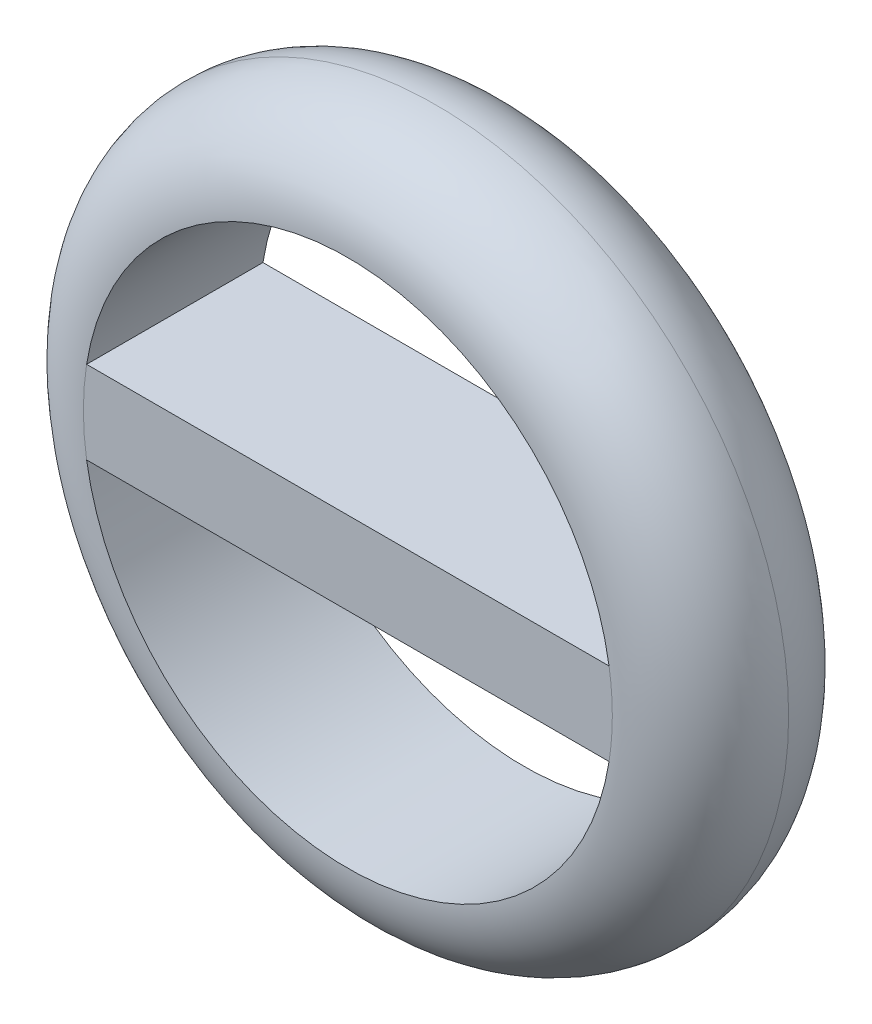
ISO-10303-21;
HEADER;
FILE_DESCRIPTION(('STEP AP214'),'2;1');
FILE_NAME('part.step','',(''),(''),'','','');
FILE_SCHEMA(('AUTOMOTIVE_DESIGN { 1 0 10303 214 1 1 1 1 }'));
ENDSEC;
DATA;
#1=APPLICATION_CONTEXT('core data for automotive mechanical design processes');
#2=APPLICATION_PROTOCOL_DEFINITION('international standard','automotive_design',2000,#1);
#3=PRODUCT_CONTEXT('',#1,'mechanical');
#4=PRODUCT('Part','Part','',(#3));
#5=PRODUCT_RELATED_PRODUCT_CATEGORY('part','',(#4));
#6=PRODUCT_DEFINITION_FORMATION('','',#4);
#7=PRODUCT_DEFINITION_CONTEXT('part definition',#1,'design');
#8=PRODUCT_DEFINITION('design','',#6,#7);
#9=PRODUCT_DEFINITION_SHAPE('','',#8);
#10=(LENGTH_UNIT() NAMED_UNIT(*) SI_UNIT(.MILLI.,.METRE.));
#11=(NAMED_UNIT(*) PLANE_ANGLE_UNIT() SI_UNIT($,.RADIAN.));
#12=(NAMED_UNIT(*) SI_UNIT($,.STERADIAN.) SOLID_ANGLE_UNIT());
#13=UNCERTAINTY_MEASURE_WITH_UNIT(LENGTH_MEASURE(1.E-05),#10,'distance_accuracy_value','');
#14=(GEOMETRIC_REPRESENTATION_CONTEXT(3) GLOBAL_UNCERTAINTY_ASSIGNED_CONTEXT((#13)) GLOBAL_UNIT_ASSIGNED_CONTEXT((#10,
#11,#12)) REPRESENTATION_CONTEXT('',''));
#15=CARTESIAN_POINT('',(0.,0.,0.));
#16=DIRECTION('',(0.,0.,1.));
#17=DIRECTION('',(1.,0.,0.));
#18=AXIS2_PLACEMENT_3D('',#15,#16,#17);
#19=CARTESIAN_POINT('',(0.,0.,10.));
#20=DIRECTION('',(0.,0.,-1.));
#21=DIRECTION('',(-1.,0.,0.));
#22=AXIS2_PLACEMENT_3D('',#19,#20,#21);
#23=CYLINDRICAL_SURFACE('',#22,15.);
#24=CARTESIAN_POINT('',(0.,0.,0.));
#25=DIRECTION('',(0.,0.,1.));
#26=DIRECTION('',(1.,0.,0.));
#27=AXIS2_PLACEMENT_3D('',#24,#25,#26);
#28=CIRCLE('',#27,15.);
#29=CARTESIAN_POINT('',(-14.8152964799248,-2.34669772487359,0.));
#30=VERTEX_POINT('',#29);
#31=CARTESIAN_POINT('',(14.8152964799248,-2.34669772487359,0.));
#32=VERTEX_POINT('',#31);
#33=EDGE_CURVE('E117',#30,#32,#28,.T.);
#34=ORIENTED_EDGE('',*,*,#33,.F.);
#35=DIRECTION('',(0.,0.,-1.));
#36=VECTOR('',#35,1.);
#37=CARTESIAN_POINT('',(-14.8152964799248,-2.34669772487359,10.));
#38=LINE('',#37,#36);
#39=CARTESIAN_POINT('',(-14.8152964799248,-2.34669772487359,10.));
#40=VERTEX_POINT('',#39);
#41=EDGE_CURVE('E127',#40,#30,#38,.T.);
#42=ORIENTED_EDGE('',*,*,#41,.F.);
#43=CARTESIAN_POINT('',(0.,0.,10.));
#44=DIRECTION('',(0.,0.,1.));
#45=DIRECTION('',(1.,0.,0.));
#46=AXIS2_PLACEMENT_3D('',#43,#44,#45);
#47=CIRCLE('',#46,15.);
#48=CARTESIAN_POINT('',(14.8152964799248,-2.34669772487359,10.));
#49=VERTEX_POINT('',#48);
#50=EDGE_CURVE('E96',#40,#49,#47,.T.);
#51=ORIENTED_EDGE('',*,*,#50,.T.);
#52=DIRECTION('',(0.,0.,-1.));
#53=VECTOR('',#52,1.);
#54=CARTESIAN_POINT('',(14.8152964799248,-2.34669772487359,10.));
#55=LINE('',#54,#53);
#56=EDGE_CURVE('E57',#49,#32,#55,.T.);
#57=ORIENTED_EDGE('',*,*,#56,.T.);
#58=EDGE_LOOP('',(#34,#42,#51,#57));
#59=FACE_BOUND('',#58,.T.);
#60=ADVANCED_FACE('F39',(#59),#23,.F.);
#61=CARTESIAN_POINT('',(0.,0.,10.));
#62=DIRECTION('',(0.,0.,-1.));
#63=DIRECTION('',(-1.,0.,0.));
#64=AXIS2_PLACEMENT_3D('',#61,#62,#63);
#65=CYLINDRICAL_SURFACE('',#64,15.);
#66=CARTESIAN_POINT('',(0.,0.,0.));
#67=DIRECTION('',(0.,0.,1.));
#68=DIRECTION('',(1.,0.,0.));
#69=AXIS2_PLACEMENT_3D('',#66,#67,#68);
#70=CIRCLE('',#69,15.);
#71=CARTESIAN_POINT('',(14.8152964799248,2.34669772487359,0.));
#72=VERTEX_POINT('',#71);
#73=CARTESIAN_POINT('',(-14.8152964799248,2.34669772487359,0.));
#74=VERTEX_POINT('',#73);
#75=EDGE_CURVE('E122',#72,#74,#70,.T.);
#76=ORIENTED_EDGE('',*,*,#75,.F.);
#77=DIRECTION('',(0.,0.,-1.));
#78=VECTOR('',#77,1.);
#79=CARTESIAN_POINT('',(14.8152964799248,2.34669772487359,10.));
#80=LINE('',#79,#78);
#81=CARTESIAN_POINT('',(14.8152964799248,2.34669772487359,10.));
#82=VERTEX_POINT('',#81);
#83=EDGE_CURVE('E111',#82,#72,#80,.T.);
#84=ORIENTED_EDGE('',*,*,#83,.F.);
#85=CARTESIAN_POINT('',(0.,0.,10.));
#86=DIRECTION('',(0.,0.,1.));
#87=DIRECTION('',(1.,0.,0.));
#88=AXIS2_PLACEMENT_3D('',#85,#86,#87);
#89=CIRCLE('',#88,15.);
#90=CARTESIAN_POINT('',(-14.8152964799248,2.34669772487359,10.));
#91=VERTEX_POINT('',#90);
#92=EDGE_CURVE('E95',#82,#91,#89,.T.);
#93=ORIENTED_EDGE('',*,*,#92,.T.);
#94=DIRECTION('',(0.,0.,-1.));
#95=VECTOR('',#94,1.);
#96=CARTESIAN_POINT('',(-14.8152964799248,2.34669772487359,10.));
#97=LINE('',#96,#95);
#98=EDGE_CURVE('E106',#91,#74,#97,.T.);
#99=ORIENTED_EDGE('',*,*,#98,.T.);
#100=EDGE_LOOP('',(#76,#84,#93,#99));
#101=FACE_BOUND('',#100,.T.);
#102=ADVANCED_FACE('F114',(#101),#65,.F.);
#103=CARTESIAN_POINT('',(0.,-2.34669772487359,10.));
#104=DIRECTION('',(0.,-1.,0.));
#105=DIRECTION('',(0.,0.,-1.));
#106=AXIS2_PLACEMENT_3D('',#103,#104,#105);
#107=PLANE('',#106);
#108=DIRECTION('',(-1.,0.,0.));
#109=VECTOR('',#108,1.);
#110=CARTESIAN_POINT('',(0.,-2.34669772487359,0.));
#111=LINE('',#110,#109);
#112=EDGE_CURVE('E115',#32,#30,#111,.T.);
#113=ORIENTED_EDGE('',*,*,#112,.F.);
#114=ORIENTED_EDGE('',*,*,#56,.F.);
#115=DIRECTION('',(-1.,0.,0.));
#116=VECTOR('',#115,1.);
#117=CARTESIAN_POINT('',(0.,-2.34669772487359,10.));
#118=LINE('',#117,#116);
#119=EDGE_CURVE('E112',#49,#40,#118,.T.);
#120=ORIENTED_EDGE('',*,*,#119,.T.);
#121=ORIENTED_EDGE('',*,*,#41,.T.);
#122=EDGE_LOOP('',(#113,#114,#120,#121));
#123=FACE_BOUND('',#122,.T.);
#124=ADVANCED_FACE('F133',(#123),#107,.T.);
#125=CARTESIAN_POINT('',(0.,2.34669772487359,10.));
#126=DIRECTION('',(0.,-1.,0.));
#127=DIRECTION('',(0.,0.,-1.));
#128=AXIS2_PLACEMENT_3D('',#125,#126,#127);
#129=PLANE('',#128);
#130=DIRECTION('',(-1.,0.,0.));
#131=VECTOR('',#130,1.);
#132=CARTESIAN_POINT('',(0.,2.34669772487359,0.));
#133=LINE('',#132,#131);
#134=EDGE_CURVE('E108',#72,#74,#133,.T.);
#135=ORIENTED_EDGE('',*,*,#134,.T.);
#136=ORIENTED_EDGE('',*,*,#98,.F.);
#137=DIRECTION('',(-1.,0.,0.));
#138=VECTOR('',#137,1.);
#139=CARTESIAN_POINT('',(0.,2.34669772487359,10.));
#140=LINE('',#139,#138);
#141=EDGE_CURVE('E99',#82,#91,#140,.T.);
#142=ORIENTED_EDGE('',*,*,#141,.F.);
#143=ORIENTED_EDGE('',*,*,#83,.T.);
#144=EDGE_LOOP('',(#135,#136,#142,#143));
#145=FACE_BOUND('',#144,.T.);
#146=ADVANCED_FACE('F107',(#145),#129,.F.);
#147=CARTESIAN_POINT('',(0.,0.,10.));
#148=DIRECTION('',(0.,0.,1.));
#149=DIRECTION('',(1.,0.,0.));
#150=AXIS2_PLACEMENT_3D('',#147,#148,#149);
#151=PLANE('',#150);
#152=ORIENTED_EDGE('',*,*,#141,.T.);
#153=CARTESIAN_POINT('',(0.,0.,10.));
#154=DIRECTION('',(0.,0.,1.));
#155=DIRECTION('',(1.,0.,0.));
#156=AXIS2_PLACEMENT_3D('',#153,#154,#155);
#157=CIRCLE('',#156,15.);
#158=EDGE_CURVE('E11',#91,#40,#157,.T.);
#159=ORIENTED_EDGE('',*,*,#158,.T.);
#160=ORIENTED_EDGE('',*,*,#119,.F.);
#161=CARTESIAN_POINT('',(0.,0.,10.));
#162=DIRECTION('',(0.,0.,1.));
#163=DIRECTION('',(1.,0.,0.));
#164=AXIS2_PLACEMENT_3D('',#161,#162,#163);
#165=CIRCLE('',#164,15.);
#166=EDGE_CURVE('E49',#49,#82,#165,.T.);
#167=ORIENTED_EDGE('',*,*,#166,.T.);
#168=EDGE_LOOP('',(#152,#159,#160,#167));
#169=FACE_BOUND('',#168,.T.);
#170=ADVANCED_FACE('F101',(#169),#151,.T.);
#171=CARTESIAN_POINT('',(0.,0.,0.));
#172=DIRECTION('',(0.,0.,1.));
#173=DIRECTION('',(1.,0.,0.));
#174=AXIS2_PLACEMENT_3D('',#171,#172,#173);
#175=PLANE('',#174);
#176=ORIENTED_EDGE('',*,*,#112,.T.);
#177=CARTESIAN_POINT('',(0.,0.,0.));
#178=DIRECTION('',(0.,0.,1.));
#179=DIRECTION('',(1.,0.,0.));
#180=AXIS2_PLACEMENT_3D('',#177,#178,#179);
#181=CIRCLE('',#180,15.);
#182=EDGE_CURVE('E73',#30,#74,#181,.F.);
#183=ORIENTED_EDGE('',*,*,#182,.T.);
#184=ORIENTED_EDGE('',*,*,#134,.F.);
#185=CARTESIAN_POINT('',(0.,0.,0.));
#186=DIRECTION('',(0.,0.,1.));
#187=DIRECTION('',(1.,0.,0.));
#188=AXIS2_PLACEMENT_3D('',#185,#186,#187);
#189=CIRCLE('',#188,15.);
#190=EDGE_CURVE('E81',#72,#32,#189,.F.);
#191=ORIENTED_EDGE('',*,*,#190,.T.);
#192=EDGE_LOOP('',(#176,#183,#184,#191));
#193=FACE_BOUND('',#192,.T.);
#194=ADVANCED_FACE('F132',(#193),#175,.F.);
#195=CARTESIAN_POINT('',(0.,0.,5.));
#196=DIRECTION('',(0.,0.,1.));
#197=DIRECTION('',(1.,0.,0.));
#198=AXIS2_PLACEMENT_3D('',#195,#196,#197);
#199=TOROIDAL_SURFACE('',#198,15.,5.);
#200=ORIENTED_EDGE('',*,*,#158,.F.);
#201=ORIENTED_EDGE('',*,*,#92,.F.);
#202=ORIENTED_EDGE('',*,*,#166,.F.);
#203=ORIENTED_EDGE('',*,*,#50,.F.);
#204=EDGE_LOOP('',(#200,#201,#202,#203));
#205=FACE_BOUND('',#204,.T.);
#206=CARTESIAN_POINT('',(0.,0.,5.));
#207=DIRECTION('',(0.,0.,1.));
#208=DIRECTION('',(1.,0.,0.));
#209=AXIS2_PLACEMENT_3D('',#206,#207,#208);
#210=CIRCLE('',#209,20.);
#211=CARTESIAN_POINT('',(20.,0.,5.));
#212=VERTEX_POINT('',#211);
#213=EDGE_CURVE('E43',#212,#212,#210,.F.);
#214=ORIENTED_EDGE('',*,*,#213,.F.);
#215=EDGE_LOOP('',(#214));
#216=FACE_BOUND('',#215,.T.);
#217=ADVANCED_FACE('F41',(#205,#216),#199,.T.);
#218=CARTESIAN_POINT('',(0.,0.,5.));
#219=DIRECTION('',(0.,0.,1.));
#220=DIRECTION('',(1.,0.,0.));
#221=AXIS2_PLACEMENT_3D('',#218,#219,#220);
#222=TOROIDAL_SURFACE('',#221,15.,5.);
#223=ORIENTED_EDGE('',*,*,#182,.F.);
#224=ORIENTED_EDGE('',*,*,#33,.T.);
#225=ORIENTED_EDGE('',*,*,#190,.F.);
#226=ORIENTED_EDGE('',*,*,#75,.T.);
#227=EDGE_LOOP('',(#223,#224,#225,#226));
#228=FACE_BOUND('',#227,.T.);
#229=ORIENTED_EDGE('',*,*,#213,.T.);
#230=EDGE_LOOP('',(#229));
#231=FACE_BOUND('',#230,.T.);
#232=ADVANCED_FACE('F135',(#228,#231),#222,.T.);
#233=CLOSED_SHELL('',(#60,#102,#124,#146,#170,#194,#217,#232));
#234=MANIFOLD_SOLID_BREP('B2',#233);
#235=ADVANCED_BREP_SHAPE_REPRESENTATION('',(#18,#234),#14);
#236=SHAPE_DEFINITION_REPRESENTATION(#9,#235);
ENDSEC;
END-ISO-10303-21;
